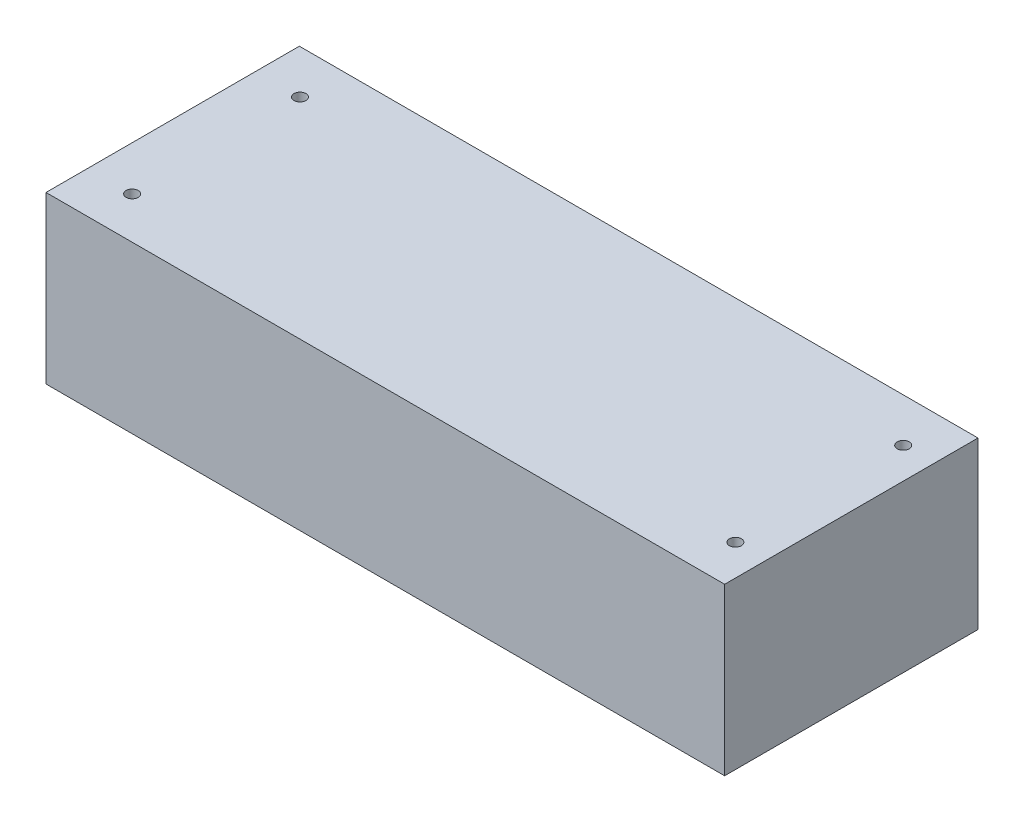
ISO-10303-21;
HEADER;
FILE_DESCRIPTION(('STEP AP214'),'2;1');
FILE_NAME('part.step','',(''),(''),'','','');
FILE_SCHEMA(('AUTOMOTIVE_DESIGN { 1 0 10303 214 1 1 1 1 }'));
ENDSEC;
DATA;
#1=APPLICATION_CONTEXT('core data for automotive mechanical design processes');
#2=APPLICATION_PROTOCOL_DEFINITION('international standard','automotive_design',2000,#1);
#3=PRODUCT_CONTEXT('',#1,'mechanical');
#4=PRODUCT('Part','Part','',(#3));
#5=PRODUCT_RELATED_PRODUCT_CATEGORY('part','',(#4));
#6=PRODUCT_DEFINITION_FORMATION('','',#4);
#7=PRODUCT_DEFINITION_CONTEXT('part definition',#1,'design');
#8=PRODUCT_DEFINITION('design','',#6,#7);
#9=PRODUCT_DEFINITION_SHAPE('','',#8);
#10=(LENGTH_UNIT() NAMED_UNIT(*) SI_UNIT(.MILLI.,.METRE.));
#11=(NAMED_UNIT(*) PLANE_ANGLE_UNIT() SI_UNIT($,.RADIAN.));
#12=(NAMED_UNIT(*) SI_UNIT($,.STERADIAN.) SOLID_ANGLE_UNIT());
#13=UNCERTAINTY_MEASURE_WITH_UNIT(LENGTH_MEASURE(1.E-05),#10,'distance_accuracy_value','');
#14=(GEOMETRIC_REPRESENTATION_CONTEXT(3) GLOBAL_UNCERTAINTY_ASSIGNED_CONTEXT((#13)) GLOBAL_UNIT_ASSIGNED_CONTEXT((#10,
#11,#12)) REPRESENTATION_CONTEXT('',''));
#15=CARTESIAN_POINT('',(0.,0.,0.));
#16=DIRECTION('',(0.,0.,1.));
#17=DIRECTION('',(1.,0.,0.));
#18=AXIS2_PLACEMENT_3D('',#15,#16,#17);
#19=CARTESIAN_POINT('',(0.,0.,84.));
#20=DIRECTION('',(1.,0.,0.));
#21=DIRECTION('',(0.,1.,0.));
#22=AXIS2_PLACEMENT_3D('',#19,#20,#21);
#23=PLANE('',#22);
#24=DIRECTION('',(0.,-1.,0.));
#25=VECTOR('',#24,1.);
#26=CARTESIAN_POINT('',(0.,0.,0.));
#27=LINE('',#26,#25);
#28=CARTESIAN_POINT('',(0.,0.,0.));
#29=VERTEX_POINT('',#28);
#30=CARTESIAN_POINT('',(0.,-55.,0.));
#31=VERTEX_POINT('',#30);
#32=EDGE_CURVE('E156',#29,#31,#27,.T.);
#33=ORIENTED_EDGE('',*,*,#32,.T.);
#34=DIRECTION('',(0.,0.,-1.));
#35=VECTOR('',#34,1.);
#36=CARTESIAN_POINT('',(0.,-55.,84.));
#37=LINE('',#36,#35);
#38=CARTESIAN_POINT('',(0.,-55.,84.));
#39=VERTEX_POINT('',#38);
#40=EDGE_CURVE('E11',#39,#31,#37,.T.);
#41=ORIENTED_EDGE('',*,*,#40,.F.);
#42=DIRECTION('',(0.,-1.,0.));
#43=VECTOR('',#42,1.);
#44=CARTESIAN_POINT('',(0.,0.,84.));
#45=LINE('',#44,#43);
#46=CARTESIAN_POINT('',(0.,0.,84.));
#47=VERTEX_POINT('',#46);
#48=EDGE_CURVE('E165',#47,#39,#45,.T.);
#49=ORIENTED_EDGE('',*,*,#48,.F.);
#50=DIRECTION('',(0.,0.,-1.));
#51=VECTOR('',#50,1.);
#52=CARTESIAN_POINT('',(0.,0.,84.));
#53=LINE('',#52,#51);
#54=EDGE_CURVE('E175',#47,#29,#53,.T.);
#55=ORIENTED_EDGE('',*,*,#54,.T.);
#56=EDGE_LOOP('',(#33,#41,#49,#55));
#57=FACE_BOUND('',#56,.T.);
#58=DIRECTION('',(0.,-1.,0.));
#59=VECTOR('',#58,1.);
#60=CARTESIAN_POINT('',(0.,0.,4.));
#61=LINE('',#60,#59);
#62=CARTESIAN_POINT('',(0.,-4.,4.));
#63=VERTEX_POINT('',#62);
#64=CARTESIAN_POINT('',(0.,-51.,4.));
#65=VERTEX_POINT('',#64);
#66=EDGE_CURVE('E119',#63,#65,#61,.T.);
#67=ORIENTED_EDGE('',*,*,#66,.F.);
#68=DIRECTION('',(0.,0.,-1.));
#69=VECTOR('',#68,1.);
#70=CARTESIAN_POINT('',(0.,-4.,84.));
#71=LINE('',#70,#69);
#72=CARTESIAN_POINT('',(0.,-4.,80.));
#73=VERTEX_POINT('',#72);
#74=EDGE_CURVE('E147',#73,#63,#71,.T.);
#75=ORIENTED_EDGE('',*,*,#74,.F.);
#76=DIRECTION('',(0.,-1.,0.));
#77=VECTOR('',#76,1.);
#78=CARTESIAN_POINT('',(0.,0.,80.));
#79=LINE('',#78,#77);
#80=CARTESIAN_POINT('',(0.,-51.,80.));
#81=VERTEX_POINT('',#80);
#82=EDGE_CURVE('E53',#73,#81,#79,.T.);
#83=ORIENTED_EDGE('',*,*,#82,.T.);
#84=DIRECTION('',(0.,0.,-1.));
#85=VECTOR('',#84,1.);
#86=CARTESIAN_POINT('',(0.,-51.,84.));
#87=LINE('',#86,#85);
#88=EDGE_CURVE('E132',#81,#65,#87,.T.);
#89=ORIENTED_EDGE('',*,*,#88,.T.);
#90=EDGE_LOOP('',(#67,#75,#83,#89));
#91=FACE_BOUND('',#90,.T.);
#92=ADVANCED_FACE('F38',(#57,#91),#23,.F.);
#93=CARTESIAN_POINT('',(0.,-55.,84.));
#94=DIRECTION('',(0.,1.,0.));
#95=DIRECTION('',(0.,0.,1.));
#96=AXIS2_PLACEMENT_3D('',#93,#94,#95);
#97=PLANE('',#96);
#98=DIRECTION('',(1.,0.,0.));
#99=VECTOR('',#98,1.);
#100=CARTESIAN_POINT('',(0.,-55.,0.));
#101=LINE('',#100,#99);
#102=CARTESIAN_POINT('',(225.,-55.,0.));
#103=VERTEX_POINT('',#102);
#104=EDGE_CURVE('E179',#31,#103,#101,.T.);
#105=ORIENTED_EDGE('',*,*,#104,.T.);
#106=DIRECTION('',(0.,0.,-1.));
#107=VECTOR('',#106,1.);
#108=CARTESIAN_POINT('',(225.,-55.,84.));
#109=LINE('',#108,#107);
#110=CARTESIAN_POINT('',(225.,-55.,84.));
#111=VERTEX_POINT('',#110);
#112=EDGE_CURVE('E46',#111,#103,#109,.T.);
#113=ORIENTED_EDGE('',*,*,#112,.F.);
#114=DIRECTION('',(1.,0.,0.));
#115=VECTOR('',#114,1.);
#116=CARTESIAN_POINT('',(0.,-55.,84.));
#117=LINE('',#116,#115);
#118=EDGE_CURVE('E90',#39,#111,#117,.T.);
#119=ORIENTED_EDGE('',*,*,#118,.F.);
#120=ORIENTED_EDGE('',*,*,#40,.T.);
#121=EDGE_LOOP('',(#105,#113,#119,#120));
#122=FACE_BOUND('',#121,.T.);
#123=ADVANCED_FACE('F217',(#122),#97,.F.);
#124=CARTESIAN_POINT('',(225.,0.,84.));
#125=DIRECTION('',(-1.,0.,0.));
#126=DIRECTION('',(0.,0.,1.));
#127=AXIS2_PLACEMENT_3D('',#124,#125,#126);
#128=PLANE('',#127);
#129=DIRECTION('',(0.,1.,0.));
#130=VECTOR('',#129,1.);
#131=CARTESIAN_POINT('',(225.,0.,0.));
#132=LINE('',#131,#130);
#133=CARTESIAN_POINT('',(225.,0.,0.));
#134=VERTEX_POINT('',#133);
#135=EDGE_CURVE('E182',#103,#134,#132,.T.);
#136=ORIENTED_EDGE('',*,*,#135,.T.);
#137=DIRECTION('',(0.,0.,-1.));
#138=VECTOR('',#137,1.);
#139=CARTESIAN_POINT('',(225.,0.,84.));
#140=LINE('',#139,#138);
#141=CARTESIAN_POINT('',(225.,0.,84.));
#142=VERTEX_POINT('',#141);
#143=EDGE_CURVE('E189',#142,#134,#140,.T.);
#144=ORIENTED_EDGE('',*,*,#143,.F.);
#145=DIRECTION('',(0.,1.,0.));
#146=VECTOR('',#145,1.);
#147=CARTESIAN_POINT('',(225.,0.,84.));
#148=LINE('',#147,#146);
#149=EDGE_CURVE('E170',#111,#142,#148,.T.);
#150=ORIENTED_EDGE('',*,*,#149,.F.);
#151=ORIENTED_EDGE('',*,*,#112,.T.);
#152=EDGE_LOOP('',(#136,#144,#150,#151));
#153=FACE_BOUND('',#152,.T.);
#154=ADVANCED_FACE('F196',(#153),#128,.F.);
#155=CARTESIAN_POINT('',(0.,0.,84.));
#156=DIRECTION('',(0.,-1.,0.));
#157=DIRECTION('',(0.,0.,-1.));
#158=AXIS2_PLACEMENT_3D('',#155,#156,#157);
#159=PLANE('',#158);
#160=CARTESIAN_POINT('',(14.7074684669015,0.,14.499999999999));
#161=DIRECTION('',(0.,-1.,0.));
#162=DIRECTION('',(0.,0.,-1.));
#163=AXIS2_PLACEMENT_3D('',#160,#161,#162);
#164=CIRCLE('',#163,1.99999999999367);
#165=CARTESIAN_POINT('',(14.7074684669015,0.,12.5000000000053));
#166=VERTEX_POINT('',#165);
#167=EDGE_CURVE('E326',#166,#166,#164,.T.);
#168=ORIENTED_EDGE('',*,*,#167,.T.);
#169=EDGE_LOOP('',(#168));
#170=FACE_BOUND('',#169,.T.);
#171=CARTESIAN_POINT('',(214.707468466902,0.,70.1438055098068));
#172=DIRECTION('',(0.,-1.,0.));
#173=DIRECTION('',(0.,0.,-1.));
#174=AXIS2_PLACEMENT_3D('',#171,#172,#173);
#175=CIRCLE('',#174,1.99999999999375);
#176=CARTESIAN_POINT('',(214.707468466902,0.,68.143805509813));
#177=VERTEX_POINT('',#176);
#178=EDGE_CURVE('E331',#177,#177,#175,.T.);
#179=ORIENTED_EDGE('',*,*,#178,.T.);
#180=EDGE_LOOP('',(#179));
#181=FACE_BOUND('',#180,.T.);
#182=CARTESIAN_POINT('',(214.707468466902,0.,14.499999999999));
#183=DIRECTION('',(0.,-1.,0.));
#184=DIRECTION('',(0.,0.,-1.));
#185=AXIS2_PLACEMENT_3D('',#182,#183,#184);
#186=CIRCLE('',#185,1.99999999999384);
#187=CARTESIAN_POINT('',(214.707468466902,0.,12.5000000000051));
#188=VERTEX_POINT('',#187);
#189=EDGE_CURVE('E345',#188,#188,#186,.T.);
#190=ORIENTED_EDGE('',*,*,#189,.T.);
#191=EDGE_LOOP('',(#190));
#192=FACE_BOUND('',#191,.T.);
#193=CARTESIAN_POINT('',(14.7074684669015,0.,70.1438055098068));
#194=DIRECTION('',(0.,-1.,0.));
#195=DIRECTION('',(0.,0.,-1.));
#196=AXIS2_PLACEMENT_3D('',#193,#194,#195);
#197=CIRCLE('',#196,1.99999999999373);
#198=CARTESIAN_POINT('',(14.7074684669015,0.,68.1438055098131));
#199=VERTEX_POINT('',#198);
#200=EDGE_CURVE('E164',#199,#199,#197,.T.);
#201=ORIENTED_EDGE('',*,*,#200,.T.);
#202=EDGE_LOOP('',(#201));
#203=FACE_BOUND('',#202,.T.);
#204=DIRECTION('',(-1.,0.,0.));
#205=VECTOR('',#204,1.);
#206=CARTESIAN_POINT('',(0.,0.,0.));
#207=LINE('',#206,#205);
#208=EDGE_CURVE('E83',#134,#29,#207,.T.);
#209=ORIENTED_EDGE('',*,*,#208,.T.);
#210=ORIENTED_EDGE('',*,*,#54,.F.);
#211=DIRECTION('',(-1.,0.,0.));
#212=VECTOR('',#211,1.);
#213=CARTESIAN_POINT('',(0.,0.,84.));
#214=LINE('',#213,#212);
#215=EDGE_CURVE('E62',#142,#47,#214,.T.);
#216=ORIENTED_EDGE('',*,*,#215,.F.);
#217=ORIENTED_EDGE('',*,*,#143,.T.);
#218=EDGE_LOOP('',(#209,#210,#216,#217));
#219=FACE_BOUND('',#218,.T.);
#220=ADVANCED_FACE('F205',(#170,#181,#192,#203,#219),#159,.F.);
#221=CARTESIAN_POINT('',(0.,0.,84.));
#222=DIRECTION('',(0.,0.,1.));
#223=DIRECTION('',(1.,0.,0.));
#224=AXIS2_PLACEMENT_3D('',#221,#222,#223);
#225=PLANE('',#224);
#226=ORIENTED_EDGE('',*,*,#48,.T.);
#227=ORIENTED_EDGE('',*,*,#118,.T.);
#228=ORIENTED_EDGE('',*,*,#149,.T.);
#229=ORIENTED_EDGE('',*,*,#215,.T.);
#230=EDGE_LOOP('',(#226,#227,#228,#229));
#231=FACE_BOUND('',#230,.T.);
#232=ADVANCED_FACE('F207',(#231),#225,.T.);
#233=CARTESIAN_POINT('',(0.,0.,0.));
#234=DIRECTION('',(0.,0.,1.));
#235=DIRECTION('',(1.,0.,0.));
#236=AXIS2_PLACEMENT_3D('',#233,#234,#235);
#237=PLANE('',#236);
#238=ORIENTED_EDGE('',*,*,#32,.F.);
#239=ORIENTED_EDGE('',*,*,#208,.F.);
#240=ORIENTED_EDGE('',*,*,#135,.F.);
#241=ORIENTED_EDGE('',*,*,#104,.F.);
#242=EDGE_LOOP('',(#238,#239,#240,#241));
#243=FACE_BOUND('',#242,.T.);
#244=ADVANCED_FACE('F200',(#243),#237,.F.);
#245=CARTESIAN_POINT('',(0.,-51.,84.));
#246=DIRECTION('',(0.,1.,0.));
#247=DIRECTION('',(0.,0.,1.));
#248=AXIS2_PLACEMENT_3D('',#245,#246,#247);
#249=PLANE('',#248);
#250=DIRECTION('',(1.,0.,0.));
#251=VECTOR('',#250,1.);
#252=CARTESIAN_POINT('',(0.,-51.,4.));
#253=LINE('',#252,#251);
#254=CARTESIAN_POINT('',(221.,-51.,4.));
#255=VERTEX_POINT('',#254);
#256=EDGE_CURVE('E112',#65,#255,#253,.T.);
#257=ORIENTED_EDGE('',*,*,#256,.F.);
#258=ORIENTED_EDGE('',*,*,#88,.F.);
#259=DIRECTION('',(1.,0.,0.));
#260=VECTOR('',#259,1.);
#261=CARTESIAN_POINT('',(0.,-51.,80.));
#262=LINE('',#261,#260);
#263=CARTESIAN_POINT('',(221.,-51.,80.));
#264=VERTEX_POINT('',#263);
#265=EDGE_CURVE('E128',#81,#264,#262,.T.);
#266=ORIENTED_EDGE('',*,*,#265,.T.);
#267=DIRECTION('',(0.,0.,-1.));
#268=VECTOR('',#267,1.);
#269=CARTESIAN_POINT('',(221.,-51.,84.));
#270=LINE('',#269,#268);
#271=EDGE_CURVE('E126',#264,#255,#270,.T.);
#272=ORIENTED_EDGE('',*,*,#271,.T.);
#273=EDGE_LOOP('',(#257,#258,#266,#272));
#274=FACE_BOUND('',#273,.T.);
#275=ADVANCED_FACE('F127',(#274),#249,.T.);
#276=CARTESIAN_POINT('',(221.,0.,84.));
#277=DIRECTION('',(-1.,0.,0.));
#278=DIRECTION('',(0.,0.,1.));
#279=AXIS2_PLACEMENT_3D('',#276,#277,#278);
#280=PLANE('',#279);
#281=DIRECTION('',(0.,1.,0.));
#282=VECTOR('',#281,1.);
#283=CARTESIAN_POINT('',(221.,0.,4.));
#284=LINE('',#283,#282);
#285=CARTESIAN_POINT('',(221.,-4.,4.));
#286=VERTEX_POINT('',#285);
#287=EDGE_CURVE('E116',#255,#286,#284,.T.);
#288=ORIENTED_EDGE('',*,*,#287,.F.);
#289=ORIENTED_EDGE('',*,*,#271,.F.);
#290=DIRECTION('',(0.,1.,0.));
#291=VECTOR('',#290,1.);
#292=CARTESIAN_POINT('',(221.,0.,80.));
#293=LINE('',#292,#291);
#294=CARTESIAN_POINT('',(221.,-4.,80.));
#295=VERTEX_POINT('',#294);
#296=EDGE_CURVE('E148',#264,#295,#293,.T.);
#297=ORIENTED_EDGE('',*,*,#296,.T.);
#298=DIRECTION('',(0.,0.,-1.));
#299=VECTOR('',#298,1.);
#300=CARTESIAN_POINT('',(221.,-4.,84.));
#301=LINE('',#300,#299);
#302=EDGE_CURVE('E133',#295,#286,#301,.T.);
#303=ORIENTED_EDGE('',*,*,#302,.T.);
#304=EDGE_LOOP('',(#288,#289,#297,#303));
#305=FACE_BOUND('',#304,.T.);
#306=ADVANCED_FACE('F135',(#305),#280,.T.);
#307=CARTESIAN_POINT('',(0.,-4.,84.));
#308=DIRECTION('',(0.,-1.,0.));
#309=DIRECTION('',(0.,0.,-1.));
#310=AXIS2_PLACEMENT_3D('',#307,#308,#309);
#311=PLANE('',#310);
#312=CARTESIAN_POINT('',(14.7074684669015,-4.,14.499999999999));
#313=DIRECTION('',(0.,-1.,0.));
#314=DIRECTION('',(0.,0.,-1.));
#315=AXIS2_PLACEMENT_3D('',#312,#313,#314);
#316=CIRCLE('',#315,1.99999999999367);
#317=CARTESIAN_POINT('',(14.7074684669015,-4.,12.5000000000053));
#318=VERTEX_POINT('',#317);
#319=EDGE_CURVE('E329',#318,#318,#316,.T.);
#320=ORIENTED_EDGE('',*,*,#319,.F.);
#321=EDGE_LOOP('',(#320));
#322=FACE_BOUND('',#321,.T.);
#323=CARTESIAN_POINT('',(214.707468466902,-4.,70.1438055098068));
#324=DIRECTION('',(0.,-1.,0.));
#325=DIRECTION('',(0.,0.,-1.));
#326=AXIS2_PLACEMENT_3D('',#323,#324,#325);
#327=CIRCLE('',#326,1.99999999999375);
#328=CARTESIAN_POINT('',(214.707468466902,-4.,68.143805509813));
#329=VERTEX_POINT('',#328);
#330=EDGE_CURVE('E338',#329,#329,#327,.T.);
#331=ORIENTED_EDGE('',*,*,#330,.F.);
#332=EDGE_LOOP('',(#331));
#333=FACE_BOUND('',#332,.T.);
#334=CARTESIAN_POINT('',(214.707468466902,-4.,14.499999999999));
#335=DIRECTION('',(0.,-1.,0.));
#336=DIRECTION('',(0.,0.,-1.));
#337=AXIS2_PLACEMENT_3D('',#334,#335,#336);
#338=CIRCLE('',#337,1.99999999999384);
#339=CARTESIAN_POINT('',(214.707468466902,-4.,12.5000000000051));
#340=VERTEX_POINT('',#339);
#341=EDGE_CURVE('E363',#340,#340,#338,.T.);
#342=ORIENTED_EDGE('',*,*,#341,.F.);
#343=EDGE_LOOP('',(#342));
#344=FACE_BOUND('',#343,.T.);
#345=CARTESIAN_POINT('',(14.7074684669015,-4.,70.1438055098068));
#346=DIRECTION('',(0.,-1.,0.));
#347=DIRECTION('',(0.,0.,-1.));
#348=AXIS2_PLACEMENT_3D('',#345,#346,#347);
#349=CIRCLE('',#348,1.99999999999373);
#350=CARTESIAN_POINT('',(14.7074684669015,-4.,68.1438055098131));
#351=VERTEX_POINT('',#350);
#352=EDGE_CURVE('E335',#351,#351,#349,.T.);
#353=ORIENTED_EDGE('',*,*,#352,.F.);
#354=EDGE_LOOP('',(#353));
#355=FACE_BOUND('',#354,.T.);
#356=DIRECTION('',(-1.,0.,0.));
#357=VECTOR('',#356,1.);
#358=CARTESIAN_POINT('',(0.,-4.,4.));
#359=LINE('',#358,#357);
#360=EDGE_CURVE('E139',#286,#63,#359,.T.);
#361=ORIENTED_EDGE('',*,*,#360,.F.);
#362=ORIENTED_EDGE('',*,*,#302,.F.);
#363=DIRECTION('',(-1.,0.,0.));
#364=VECTOR('',#363,1.);
#365=CARTESIAN_POINT('',(0.,-4.,80.));
#366=LINE('',#365,#364);
#367=EDGE_CURVE('E150',#295,#73,#366,.T.);
#368=ORIENTED_EDGE('',*,*,#367,.T.);
#369=ORIENTED_EDGE('',*,*,#74,.T.);
#370=EDGE_LOOP('',(#361,#362,#368,#369));
#371=FACE_BOUND('',#370,.T.);
#372=ADVANCED_FACE('F257',(#322,#333,#344,#355,#371),#311,.T.);
#373=CARTESIAN_POINT('',(0.,0.,80.));
#374=DIRECTION('',(0.,0.,1.));
#375=DIRECTION('',(1.,0.,0.));
#376=AXIS2_PLACEMENT_3D('',#373,#374,#375);
#377=PLANE('',#376);
#378=ORIENTED_EDGE('',*,*,#82,.F.);
#379=ORIENTED_EDGE('',*,*,#367,.F.);
#380=ORIENTED_EDGE('',*,*,#296,.F.);
#381=ORIENTED_EDGE('',*,*,#265,.F.);
#382=EDGE_LOOP('',(#378,#379,#380,#381));
#383=FACE_BOUND('',#382,.T.);
#384=ADVANCED_FACE('F265',(#383),#377,.F.);
#385=CARTESIAN_POINT('',(0.,0.,4.));
#386=DIRECTION('',(0.,0.,1.));
#387=DIRECTION('',(1.,0.,0.));
#388=AXIS2_PLACEMENT_3D('',#385,#386,#387);
#389=PLANE('',#388);
#390=ORIENTED_EDGE('',*,*,#66,.T.);
#391=ORIENTED_EDGE('',*,*,#256,.T.);
#392=ORIENTED_EDGE('',*,*,#287,.T.);
#393=ORIENTED_EDGE('',*,*,#360,.T.);
#394=EDGE_LOOP('',(#390,#391,#392,#393));
#395=FACE_BOUND('',#394,.T.);
#396=ADVANCED_FACE('F114',(#395),#389,.T.);
#397=CARTESIAN_POINT('',(14.7074684669015,0.,70.1438055098068));
#398=DIRECTION('',(0.,-1.,0.));
#399=DIRECTION('',(0.,0.,-1.));
#400=AXIS2_PLACEMENT_3D('',#397,#398,#399);
#401=CYLINDRICAL_SURFACE('',#400,1.99999999999373);
#402=ORIENTED_EDGE('',*,*,#200,.F.);
#403=EDGE_LOOP('',(#402));
#404=FACE_BOUND('',#403,.T.);
#405=ORIENTED_EDGE('',*,*,#352,.T.);
#406=EDGE_LOOP('',(#405));
#407=FACE_BOUND('',#406,.T.);
#408=ADVANCED_FACE('F279',(#404,#407),#401,.F.);
#409=CARTESIAN_POINT('',(214.707468466902,0.,14.499999999999));
#410=DIRECTION('',(0.,-1.,0.));
#411=DIRECTION('',(0.,0.,-1.));
#412=AXIS2_PLACEMENT_3D('',#409,#410,#411);
#413=CYLINDRICAL_SURFACE('',#412,1.99999999999384);
#414=ORIENTED_EDGE('',*,*,#189,.F.);
#415=EDGE_LOOP('',(#414));
#416=FACE_BOUND('',#415,.T.);
#417=ORIENTED_EDGE('',*,*,#341,.T.);
#418=EDGE_LOOP('',(#417));
#419=FACE_BOUND('',#418,.T.);
#420=ADVANCED_FACE('F285',(#416,#419),#413,.F.);
#421=CARTESIAN_POINT('',(214.707468466902,0.,70.1438055098068));
#422=DIRECTION('',(0.,-1.,0.));
#423=DIRECTION('',(0.,0.,-1.));
#424=AXIS2_PLACEMENT_3D('',#421,#422,#423);
#425=CYLINDRICAL_SURFACE('',#424,1.99999999999375);
#426=ORIENTED_EDGE('',*,*,#178,.F.);
#427=EDGE_LOOP('',(#426));
#428=FACE_BOUND('',#427,.T.);
#429=ORIENTED_EDGE('',*,*,#330,.T.);
#430=EDGE_LOOP('',(#429));
#431=FACE_BOUND('',#430,.T.);
#432=ADVANCED_FACE('F293',(#428,#431),#425,.F.);
#433=CARTESIAN_POINT('',(14.7074684669015,0.,14.499999999999));
#434=DIRECTION('',(0.,-1.,0.));
#435=DIRECTION('',(0.,0.,-1.));
#436=AXIS2_PLACEMENT_3D('',#433,#434,#435);
#437=CYLINDRICAL_SURFACE('',#436,1.99999999999367);
#438=ORIENTED_EDGE('',*,*,#167,.F.);
#439=EDGE_LOOP('',(#438));
#440=FACE_BOUND('',#439,.T.);
#441=ORIENTED_EDGE('',*,*,#319,.T.);
#442=EDGE_LOOP('',(#441));
#443=FACE_BOUND('',#442,.T.);
#444=ADVANCED_FACE('F301',(#440,#443),#437,.F.);
#445=CLOSED_SHELL('',(#92,#123,#154,#220,#232,#244,#275,#306,#372,#384,#396,#408,#420,#432,#444));
#446=MANIFOLD_SOLID_BREP('B2',#445);
#447=ADVANCED_BREP_SHAPE_REPRESENTATION('',(#18,#446),#14);
#448=SHAPE_DEFINITION_REPRESENTATION(#9,#447);
ENDSEC;
END-ISO-10303-21;
